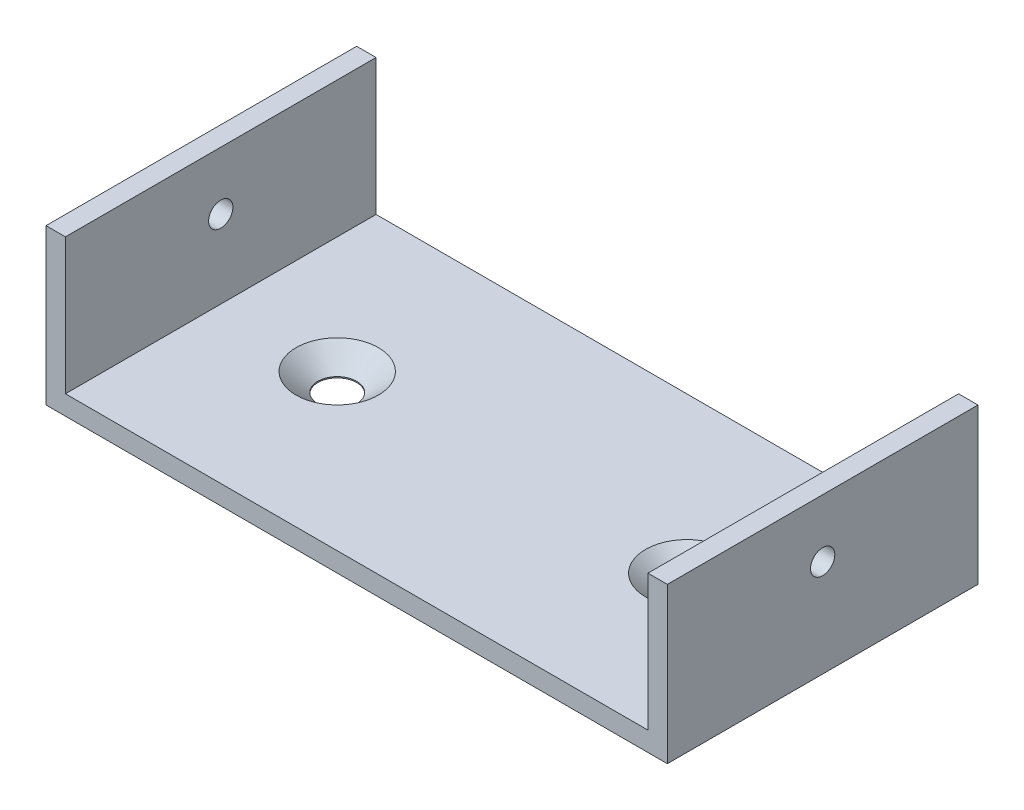
ISO-10303-21;
HEADER;
FILE_DESCRIPTION(('STEP AP214'),'2;1');
FILE_NAME('part.step','',(''),(''),'','','');
FILE_SCHEMA(('AUTOMOTIVE_DESIGN { 1 0 10303 214 1 1 1 1 }'));
ENDSEC;
DATA;
#1=APPLICATION_CONTEXT('core data for automotive mechanical design processes');
#2=APPLICATION_PROTOCOL_DEFINITION('international standard','automotive_design',2000,#1);
#3=PRODUCT_CONTEXT('',#1,'mechanical');
#4=PRODUCT('Part','Part','',(#3));
#5=PRODUCT_RELATED_PRODUCT_CATEGORY('part','',(#4));
#6=PRODUCT_DEFINITION_FORMATION('','',#4);
#7=PRODUCT_DEFINITION_CONTEXT('part definition',#1,'design');
#8=PRODUCT_DEFINITION('design','',#6,#7);
#9=PRODUCT_DEFINITION_SHAPE('','',#8);
#10=(LENGTH_UNIT() NAMED_UNIT(*) SI_UNIT(.MILLI.,.METRE.));
#11=(NAMED_UNIT(*) PLANE_ANGLE_UNIT() SI_UNIT($,.RADIAN.));
#12=(NAMED_UNIT(*) SI_UNIT($,.STERADIAN.) SOLID_ANGLE_UNIT());
#13=UNCERTAINTY_MEASURE_WITH_UNIT(LENGTH_MEASURE(1.E-05),#10,'distance_accuracy_value','');
#14=(GEOMETRIC_REPRESENTATION_CONTEXT(3) GLOBAL_UNCERTAINTY_ASSIGNED_CONTEXT((#13)) GLOBAL_UNIT_ASSIGNED_CONTEXT((#10,
#11,#12)) REPRESENTATION_CONTEXT('',''));
#15=CARTESIAN_POINT('',(0.,0.,0.));
#16=DIRECTION('',(0.,0.,1.));
#17=DIRECTION('',(1.,0.,0.));
#18=AXIS2_PLACEMENT_3D('',#15,#16,#17);
#19=CARTESIAN_POINT('',(-47.625,12.7,25.4));
#20=DIRECTION('',(0.,-1.,0.));
#21=DIRECTION('',(1.,0.,0.));
#22=AXIS2_PLACEMENT_3D('',#19,#20,#21);
#23=PLANE('',#22);
#24=DIRECTION('',(-1.,0.,0.));
#25=VECTOR('',#24,1.);
#26=CARTESIAN_POINT('',(-47.625,12.7,-25.4));
#27=LINE('',#26,#25);
#28=CARTESIAN_POINT('',(-47.625,12.7,-25.4));
#29=VERTEX_POINT('',#28);
#30=CARTESIAN_POINT('',(-50.8,12.7,-25.4));
#31=VERTEX_POINT('',#30);
#32=EDGE_CURVE('E133',#29,#31,#27,.T.);
#33=ORIENTED_EDGE('',*,*,#32,.T.);
#34=DIRECTION('',(0.,0.,-1.));
#35=VECTOR('',#34,1.);
#36=CARTESIAN_POINT('',(-50.8,12.7,25.4));
#37=LINE('',#36,#35);
#38=CARTESIAN_POINT('',(-50.8,12.7,25.4));
#39=VERTEX_POINT('',#38);
#40=EDGE_CURVE('E11',#39,#31,#37,.T.);
#41=ORIENTED_EDGE('',*,*,#40,.F.);
#42=DIRECTION('',(-1.,0.,0.));
#43=VECTOR('',#42,1.);
#44=CARTESIAN_POINT('',(-47.625,12.7,25.4));
#45=LINE('',#44,#43);
#46=CARTESIAN_POINT('',(-47.625,12.7,25.4));
#47=VERTEX_POINT('',#46);
#48=EDGE_CURVE('E148',#47,#39,#45,.T.);
#49=ORIENTED_EDGE('',*,*,#48,.F.);
#50=DIRECTION('',(0.,0.,-1.));
#51=VECTOR('',#50,1.);
#52=CARTESIAN_POINT('',(-47.625,12.7,25.4));
#53=LINE('',#52,#51);
#54=EDGE_CURVE('E129',#47,#29,#53,.T.);
#55=ORIENTED_EDGE('',*,*,#54,.T.);
#56=EDGE_LOOP('',(#33,#41,#49,#55));
#57=FACE_BOUND('',#56,.T.);
#58=ADVANCED_FACE('F36',(#57),#23,.F.);
#59=CARTESIAN_POINT('',(-50.8,12.7,25.4));
#60=DIRECTION('',(1.,0.,0.));
#61=DIRECTION('',(0.,0.,-1.));
#62=AXIS2_PLACEMENT_3D('',#59,#60,#61);
#63=PLANE('',#62);
#64=CARTESIAN_POINT('',(-50.8,3.21584337728158,0.));
#65=DIRECTION('',(1.,0.,0.));
#66=DIRECTION('',(0.,0.,-1.));
#67=AXIS2_PLACEMENT_3D('',#64,#65,#66);
#68=CIRCLE('',#67,1.98437499999997);
#69=CARTESIAN_POINT('',(-50.8,3.21584337728158,-1.98437499999997));
#70=VERTEX_POINT('',#69);
#71=EDGE_CURVE('E202',#70,#70,#68,.T.);
#72=ORIENTED_EDGE('',*,*,#71,.T.);
#73=EDGE_LOOP('',(#72));
#74=FACE_BOUND('',#73,.T.);
#75=DIRECTION('',(0.,-1.,0.));
#76=VECTOR('',#75,1.);
#77=CARTESIAN_POINT('',(-50.8,12.7,-25.4));
#78=LINE('',#77,#76);
#79=CARTESIAN_POINT('',(-50.8,-12.7,-25.4));
#80=VERTEX_POINT('',#79);
#81=EDGE_CURVE('E136',#31,#80,#78,.T.);
#82=ORIENTED_EDGE('',*,*,#81,.T.);
#83=DIRECTION('',(0.,0.,-1.));
#84=VECTOR('',#83,1.);
#85=CARTESIAN_POINT('',(-50.8,-12.7,25.4));
#86=LINE('',#85,#84);
#87=CARTESIAN_POINT('',(-50.8,-12.7,25.4));
#88=VERTEX_POINT('',#87);
#89=EDGE_CURVE('E45',#88,#80,#86,.T.);
#90=ORIENTED_EDGE('',*,*,#89,.F.);
#91=DIRECTION('',(0.,-1.,0.));
#92=VECTOR('',#91,1.);
#93=CARTESIAN_POINT('',(-50.8,12.7,25.4));
#94=LINE('',#93,#92);
#95=EDGE_CURVE('E96',#39,#88,#94,.T.);
#96=ORIENTED_EDGE('',*,*,#95,.F.);
#97=ORIENTED_EDGE('',*,*,#40,.T.);
#98=EDGE_LOOP('',(#82,#90,#96,#97));
#99=FACE_BOUND('',#98,.T.);
#100=ADVANCED_FACE('F219',(#74,#99),#63,.F.);
#101=CARTESIAN_POINT('',(-50.8,-12.7,25.4));
#102=DIRECTION('',(0.,1.,0.));
#103=DIRECTION('',(0.,0.,1.));
#104=AXIS2_PLACEMENT_3D('',#101,#102,#103);
#105=PLANE('',#104);
#106=CARTESIAN_POINT('',(-28.575,-12.7,0.));
#107=DIRECTION('',(0.,1.,0.));
#108=DIRECTION('',(0.,0.,1.));
#109=AXIS2_PLACEMENT_3D('',#106,#107,#108);
#110=CIRCLE('',#109,3.17499999999999);
#111=CARTESIAN_POINT('',(-28.575,-12.7,3.17499999999999));
#112=VERTEX_POINT('',#111);
#113=EDGE_CURVE('E190',#112,#112,#110,.T.);
#114=ORIENTED_EDGE('',*,*,#113,.T.);
#115=EDGE_LOOP('',(#114));
#116=FACE_BOUND('',#115,.T.);
#117=CARTESIAN_POINT('',(28.575,-12.7,0.));
#118=DIRECTION('',(0.,1.,0.));
#119=DIRECTION('',(0.,0.,1.));
#120=AXIS2_PLACEMENT_3D('',#117,#118,#119);
#121=CIRCLE('',#120,3.17499999999999);
#122=CARTESIAN_POINT('',(28.575,-12.7,3.175));
#123=VERTEX_POINT('',#122);
#124=EDGE_CURVE('E137',#123,#123,#121,.T.);
#125=ORIENTED_EDGE('',*,*,#124,.T.);
#126=EDGE_LOOP('',(#125));
#127=FACE_BOUND('',#126,.T.);
#128=DIRECTION('',(1.,0.,0.));
#129=VECTOR('',#128,1.);
#130=CARTESIAN_POINT('',(-50.8,-12.7,-25.4));
#131=LINE('',#130,#129);
#132=CARTESIAN_POINT('',(50.8,-12.7,-25.4));
#133=VERTEX_POINT('',#132);
#134=EDGE_CURVE('E139',#80,#133,#131,.T.);
#135=ORIENTED_EDGE('',*,*,#134,.T.);
#136=DIRECTION('',(0.,0.,-1.));
#137=VECTOR('',#136,1.);
#138=CARTESIAN_POINT('',(50.8,-12.7,25.4));
#139=LINE('',#138,#137);
#140=CARTESIAN_POINT('',(50.8,-12.7,25.4));
#141=VERTEX_POINT('',#140);
#142=EDGE_CURVE('E155',#141,#133,#139,.T.);
#143=ORIENTED_EDGE('',*,*,#142,.F.);
#144=DIRECTION('',(1.,0.,0.));
#145=VECTOR('',#144,1.);
#146=CARTESIAN_POINT('',(-50.8,-12.7,25.4));
#147=LINE('',#146,#145);
#148=EDGE_CURVE('E164',#88,#141,#147,.T.);
#149=ORIENTED_EDGE('',*,*,#148,.F.);
#150=ORIENTED_EDGE('',*,*,#89,.T.);
#151=EDGE_LOOP('',(#135,#143,#149,#150));
#152=FACE_BOUND('',#151,.T.);
#153=ADVANCED_FACE('F162',(#116,#127,#152),#105,.F.);
#154=CARTESIAN_POINT('',(50.8,-12.7,25.4));
#155=DIRECTION('',(-1.,0.,0.));
#156=DIRECTION('',(0.,0.,1.));
#157=AXIS2_PLACEMENT_3D('',#154,#155,#156);
#158=PLANE('',#157);
#159=CARTESIAN_POINT('',(50.8,3.21584337728158,0.));
#160=DIRECTION('',(1.,0.,0.));
#161=DIRECTION('',(0.,0.,-1.));
#162=AXIS2_PLACEMENT_3D('',#159,#160,#161);
#163=CIRCLE('',#162,1.98437499999999);
#164=CARTESIAN_POINT('',(50.8,3.21584337728158,-1.98437499999999));
#165=VERTEX_POINT('',#164);
#166=EDGE_CURVE('E205',#165,#165,#163,.T.);
#167=ORIENTED_EDGE('',*,*,#166,.F.);
#168=EDGE_LOOP('',(#167));
#169=FACE_BOUND('',#168,.T.);
#170=DIRECTION('',(0.,1.,0.));
#171=VECTOR('',#170,1.);
#172=CARTESIAN_POINT('',(50.8,-12.7,-25.4));
#173=LINE('',#172,#171);
#174=CARTESIAN_POINT('',(50.8,12.7,-25.4));
#175=VERTEX_POINT('',#174);
#176=EDGE_CURVE('E141',#133,#175,#173,.T.);
#177=ORIENTED_EDGE('',*,*,#176,.T.);
#178=DIRECTION('',(0.,0.,-1.));
#179=VECTOR('',#178,1.);
#180=CARTESIAN_POINT('',(50.8,12.7,25.4));
#181=LINE('',#180,#179);
#182=CARTESIAN_POINT('',(50.8,12.7,25.4));
#183=VERTEX_POINT('',#182);
#184=EDGE_CURVE('E152',#183,#175,#181,.T.);
#185=ORIENTED_EDGE('',*,*,#184,.F.);
#186=DIRECTION('',(0.,1.,0.));
#187=VECTOR('',#186,1.);
#188=CARTESIAN_POINT('',(50.8,-12.7,25.4));
#189=LINE('',#188,#187);
#190=EDGE_CURVE('E176',#141,#183,#189,.T.);
#191=ORIENTED_EDGE('',*,*,#190,.F.);
#192=ORIENTED_EDGE('',*,*,#142,.T.);
#193=EDGE_LOOP('',(#177,#185,#191,#192));
#194=FACE_BOUND('',#193,.T.);
#195=ADVANCED_FACE('F172',(#169,#194),#158,.F.);
#196=CARTESIAN_POINT('',(50.8,12.7,25.4));
#197=DIRECTION('',(0.,-1.,0.));
#198=DIRECTION('',(1.,0.,0.));
#199=AXIS2_PLACEMENT_3D('',#196,#197,#198);
#200=PLANE('',#199);
#201=DIRECTION('',(-1.,0.,0.));
#202=VECTOR('',#201,1.);
#203=CARTESIAN_POINT('',(50.8,12.7,-25.4));
#204=LINE('',#203,#202);
#205=CARTESIAN_POINT('',(47.625,12.7,-25.4));
#206=VERTEX_POINT('',#205);
#207=EDGE_CURVE('E143',#175,#206,#204,.T.);
#208=ORIENTED_EDGE('',*,*,#207,.T.);
#209=DIRECTION('',(0.,0.,-1.));
#210=VECTOR('',#209,1.);
#211=CARTESIAN_POINT('',(47.625,12.7,25.4));
#212=LINE('',#211,#210);
#213=CARTESIAN_POINT('',(47.625,12.7,25.4));
#214=VERTEX_POINT('',#213);
#215=EDGE_CURVE('E124',#214,#206,#212,.T.);
#216=ORIENTED_EDGE('',*,*,#215,.F.);
#217=DIRECTION('',(-1.,0.,0.));
#218=VECTOR('',#217,1.);
#219=CARTESIAN_POINT('',(50.8,12.7,25.4));
#220=LINE('',#219,#218);
#221=EDGE_CURVE('E115',#183,#214,#220,.T.);
#222=ORIENTED_EDGE('',*,*,#221,.F.);
#223=ORIENTED_EDGE('',*,*,#184,.T.);
#224=EDGE_LOOP('',(#208,#216,#222,#223));
#225=FACE_BOUND('',#224,.T.);
#226=ADVANCED_FACE('F175',(#225),#200,.F.);
#227=CARTESIAN_POINT('',(47.625,12.7,25.4));
#228=DIRECTION('',(1.,0.,0.));
#229=DIRECTION('',(0.,0.,-1.));
#230=AXIS2_PLACEMENT_3D('',#227,#228,#229);
#231=PLANE('',#230);
#232=CARTESIAN_POINT('',(47.625,3.21584337728158,0.));
#233=DIRECTION('',(1.,0.,0.));
#234=DIRECTION('',(0.,0.,-1.));
#235=AXIS2_PLACEMENT_3D('',#232,#233,#234);
#236=CIRCLE('',#235,1.98437499999998);
#237=CARTESIAN_POINT('',(47.625,3.21584337728158,-1.98437499999998));
#238=VERTEX_POINT('',#237);
#239=EDGE_CURVE('E39',#238,#238,#236,.T.);
#240=ORIENTED_EDGE('',*,*,#239,.T.);
#241=EDGE_LOOP('',(#240));
#242=FACE_BOUND('',#241,.T.);
#243=DIRECTION('',(0.,-1.,0.));
#244=VECTOR('',#243,1.);
#245=CARTESIAN_POINT('',(47.625,12.7,-25.4));
#246=LINE('',#245,#244);
#247=CARTESIAN_POINT('',(47.625,-9.525,-25.4));
#248=VERTEX_POINT('',#247);
#249=EDGE_CURVE('E123',#206,#248,#246,.T.);
#250=ORIENTED_EDGE('',*,*,#249,.T.);
#251=DIRECTION('',(0.,0.,-1.));
#252=VECTOR('',#251,1.);
#253=CARTESIAN_POINT('',(47.625,-9.525,25.4));
#254=LINE('',#253,#252);
#255=CARTESIAN_POINT('',(47.625,-9.525,25.4));
#256=VERTEX_POINT('',#255);
#257=EDGE_CURVE('E120',#256,#248,#254,.T.);
#258=ORIENTED_EDGE('',*,*,#257,.F.);
#259=DIRECTION('',(0.,-1.,0.));
#260=VECTOR('',#259,1.);
#261=CARTESIAN_POINT('',(47.625,12.7,25.4));
#262=LINE('',#261,#260);
#263=EDGE_CURVE('E109',#214,#256,#262,.T.);
#264=ORIENTED_EDGE('',*,*,#263,.F.);
#265=ORIENTED_EDGE('',*,*,#215,.T.);
#266=EDGE_LOOP('',(#250,#258,#264,#265));
#267=FACE_BOUND('',#266,.T.);
#268=ADVANCED_FACE('F121',(#242,#267),#231,.F.);
#269=CARTESIAN_POINT('',(47.625,-9.525,25.4));
#270=DIRECTION('',(0.,-1.,0.));
#271=DIRECTION('',(1.,0.,0.));
#272=AXIS2_PLACEMENT_3D('',#269,#270,#271);
#273=PLANE('',#272);
#274=CARTESIAN_POINT('',(-28.575,-9.52500000000001,0.));
#275=DIRECTION('',(0.,1.,0.));
#276=DIRECTION('',(0.,0.,1.));
#277=AXIS2_PLACEMENT_3D('',#274,#275,#276);
#278=CIRCLE('',#277,6.731);
#279=CARTESIAN_POINT('',(-28.575,-9.52500000000001,6.731));
#280=VERTEX_POINT('',#279);
#281=EDGE_CURVE('E196',#280,#280,#278,.T.);
#282=ORIENTED_EDGE('',*,*,#281,.F.);
#283=EDGE_LOOP('',(#282));
#284=FACE_BOUND('',#283,.T.);
#285=CARTESIAN_POINT('',(28.575,-9.525,0.));
#286=DIRECTION('',(0.,1.,0.));
#287=DIRECTION('',(0.,0.,1.));
#288=AXIS2_PLACEMENT_3D('',#285,#286,#287);
#289=CIRCLE('',#288,6.731);
#290=CARTESIAN_POINT('',(28.575,-9.525,6.731));
#291=VERTEX_POINT('',#290);
#292=EDGE_CURVE('E187',#291,#291,#289,.T.);
#293=ORIENTED_EDGE('',*,*,#292,.F.);
#294=EDGE_LOOP('',(#293));
#295=FACE_BOUND('',#294,.T.);
#296=DIRECTION('',(-1.,0.,0.));
#297=VECTOR('',#296,1.);
#298=CARTESIAN_POINT('',(47.625,-9.525,-25.4));
#299=LINE('',#298,#297);
#300=CARTESIAN_POINT('',(-47.625,-9.52500000000001,-25.4));
#301=VERTEX_POINT('',#300);
#302=EDGE_CURVE('E82',#248,#301,#299,.T.);
#303=ORIENTED_EDGE('',*,*,#302,.T.);
#304=DIRECTION('',(0.,0.,-1.));
#305=VECTOR('',#304,1.);
#306=CARTESIAN_POINT('',(-47.625,-9.52500000000001,25.4));
#307=LINE('',#306,#305);
#308=CARTESIAN_POINT('',(-47.625,-9.52500000000001,25.4));
#309=VERTEX_POINT('',#308);
#310=EDGE_CURVE('E125',#309,#301,#307,.T.);
#311=ORIENTED_EDGE('',*,*,#310,.F.);
#312=DIRECTION('',(-1.,0.,0.));
#313=VECTOR('',#312,1.);
#314=CARTESIAN_POINT('',(47.625,-9.525,25.4));
#315=LINE('',#314,#313);
#316=EDGE_CURVE('E113',#256,#309,#315,.T.);
#317=ORIENTED_EDGE('',*,*,#316,.F.);
#318=ORIENTED_EDGE('',*,*,#257,.T.);
#319=EDGE_LOOP('',(#303,#311,#317,#318));
#320=FACE_BOUND('',#319,.T.);
#321=ADVANCED_FACE('F127',(#284,#295,#320),#273,.F.);
#322=CARTESIAN_POINT('',(-47.625,-9.52500000000001,25.4));
#323=DIRECTION('',(-1.,0.,0.));
#324=DIRECTION('',(0.,0.,1.));
#325=AXIS2_PLACEMENT_3D('',#322,#323,#324);
#326=PLANE('',#325);
#327=CARTESIAN_POINT('',(-47.625,3.21584337728158,0.));
#328=DIRECTION('',(-1.,0.,0.));
#329=DIRECTION('',(0.,0.,1.));
#330=AXIS2_PLACEMENT_3D('',#327,#328,#329);
#331=CIRCLE('',#330,1.98437499999998);
#332=CARTESIAN_POINT('',(-47.625,3.21584337728158,1.98437499999998));
#333=VERTEX_POINT('',#332);
#334=EDGE_CURVE('E199',#333,#333,#331,.T.);
#335=ORIENTED_EDGE('',*,*,#334,.T.);
#336=EDGE_LOOP('',(#335));
#337=FACE_BOUND('',#336,.T.);
#338=DIRECTION('',(0.,1.,0.));
#339=VECTOR('',#338,1.);
#340=CARTESIAN_POINT('',(-47.625,-9.52500000000001,-25.4));
#341=LINE('',#340,#339);
#342=EDGE_CURVE('E88',#301,#29,#341,.T.);
#343=ORIENTED_EDGE('',*,*,#342,.T.);
#344=ORIENTED_EDGE('',*,*,#54,.F.);
#345=DIRECTION('',(0.,1.,0.));
#346=VECTOR('',#345,1.);
#347=CARTESIAN_POINT('',(-47.625,-9.52500000000001,25.4));
#348=LINE('',#347,#346);
#349=EDGE_CURVE('E53',#309,#47,#348,.T.);
#350=ORIENTED_EDGE('',*,*,#349,.F.);
#351=ORIENTED_EDGE('',*,*,#310,.T.);
#352=EDGE_LOOP('',(#343,#344,#350,#351));
#353=FACE_BOUND('',#352,.T.);
#354=ADVANCED_FACE('F230',(#337,#353),#326,.F.);
#355=CARTESIAN_POINT('',(0.,0.,25.4));
#356=DIRECTION('',(0.,0.,1.));
#357=DIRECTION('',(1.,0.,0.));
#358=AXIS2_PLACEMENT_3D('',#355,#356,#357);
#359=PLANE('',#358);
#360=ORIENTED_EDGE('',*,*,#48,.T.);
#361=ORIENTED_EDGE('',*,*,#95,.T.);
#362=ORIENTED_EDGE('',*,*,#148,.T.);
#363=ORIENTED_EDGE('',*,*,#190,.T.);
#364=ORIENTED_EDGE('',*,*,#221,.T.);
#365=ORIENTED_EDGE('',*,*,#263,.T.);
#366=ORIENTED_EDGE('',*,*,#316,.T.);
#367=ORIENTED_EDGE('',*,*,#349,.T.);
#368=EDGE_LOOP('',(#360,#361,#362,#363,#364,#365,#366,#367));
#369=FACE_BOUND('',#368,.T.);
#370=ADVANCED_FACE('F111',(#369),#359,.T.);
#371=CARTESIAN_POINT('',(0.,0.,-25.4));
#372=DIRECTION('',(0.,0.,1.));
#373=DIRECTION('',(1.,0.,0.));
#374=AXIS2_PLACEMENT_3D('',#371,#372,#373);
#375=PLANE('',#374);
#376=ORIENTED_EDGE('',*,*,#32,.F.);
#377=ORIENTED_EDGE('',*,*,#342,.F.);
#378=ORIENTED_EDGE('',*,*,#302,.F.);
#379=ORIENTED_EDGE('',*,*,#249,.F.);
#380=ORIENTED_EDGE('',*,*,#207,.F.);
#381=ORIENTED_EDGE('',*,*,#176,.F.);
#382=ORIENTED_EDGE('',*,*,#134,.F.);
#383=ORIENTED_EDGE('',*,*,#81,.F.);
#384=EDGE_LOOP('',(#376,#377,#378,#379,#380,#381,#382,#383));
#385=FACE_BOUND('',#384,.T.);
#386=ADVANCED_FACE('F168',(#385),#375,.F.);
#387=CARTESIAN_POINT('',(28.575,-9.525,0.));
#388=DIRECTION('',(0.,1.,0.));
#389=DIRECTION('',(0.,0.,1.));
#390=AXIS2_PLACEMENT_3D('',#387,#388,#389);
#391=CYLINDRICAL_SURFACE('',#390,3.175);
#392=ORIENTED_EDGE('',*,*,#124,.F.);
#393=EDGE_LOOP('',(#392));
#394=FACE_BOUND('',#393,.T.);
#395=CARTESIAN_POINT('',(28.575,-12.5088382884664,0.));
#396=DIRECTION('',(0.,1.,0.));
#397=DIRECTION('',(0.,0.,1.));
#398=AXIS2_PLACEMENT_3D('',#395,#396,#397);
#399=CIRCLE('',#398,3.175);
#400=CARTESIAN_POINT('',(28.575,-12.5088382884664,3.175));
#401=VERTEX_POINT('',#400);
#402=EDGE_CURVE('E184',#401,#401,#399,.T.);
#403=ORIENTED_EDGE('',*,*,#402,.T.);
#404=EDGE_LOOP('',(#403));
#405=FACE_BOUND('',#404,.T.);
#406=ADVANCED_FACE('F268',(#394,#405),#391,.F.);
#407=CARTESIAN_POINT('',(28.575,-9.525,0.));
#408=DIRECTION('',(0.,1.,0.));
#409=DIRECTION('',(0.,0.,1.));
#410=AXIS2_PLACEMENT_3D('',#407,#408,#409);
#411=CONICAL_SURFACE('',#410,6.731,0.872664625997164);
#412=ORIENTED_EDGE('',*,*,#402,.F.);
#413=EDGE_LOOP('',(#412));
#414=FACE_BOUND('',#413,.T.);
#415=ORIENTED_EDGE('',*,*,#292,.T.);
#416=EDGE_LOOP('',(#415));
#417=FACE_BOUND('',#416,.T.);
#418=ADVANCED_FACE('F264',(#414,#417),#411,.F.);
#419=CARTESIAN_POINT('',(-28.575,-9.52500000000001,0.));
#420=DIRECTION('',(0.,1.,0.));
#421=DIRECTION('',(0.,0.,1.));
#422=AXIS2_PLACEMENT_3D('',#419,#420,#421);
#423=CYLINDRICAL_SURFACE('',#422,3.175);
#424=ORIENTED_EDGE('',*,*,#113,.F.);
#425=EDGE_LOOP('',(#424));
#426=FACE_BOUND('',#425,.T.);
#427=CARTESIAN_POINT('',(-28.575,-12.5088382884664,0.));
#428=DIRECTION('',(0.,1.,0.));
#429=DIRECTION('',(0.,0.,1.));
#430=AXIS2_PLACEMENT_3D('',#427,#428,#429);
#431=CIRCLE('',#430,3.175);
#432=CARTESIAN_POINT('',(-28.575,-12.5088382884664,3.175));
#433=VERTEX_POINT('',#432);
#434=EDGE_CURVE('E193',#433,#433,#431,.T.);
#435=ORIENTED_EDGE('',*,*,#434,.T.);
#436=EDGE_LOOP('',(#435));
#437=FACE_BOUND('',#436,.T.);
#438=ADVANCED_FACE('F258',(#426,#437),#423,.F.);
#439=CARTESIAN_POINT('',(-28.575,-9.52500000000001,0.));
#440=DIRECTION('',(0.,1.,0.));
#441=DIRECTION('',(0.,0.,1.));
#442=AXIS2_PLACEMENT_3D('',#439,#440,#441);
#443=CONICAL_SURFACE('',#442,6.731,0.872664625997165);
#444=ORIENTED_EDGE('',*,*,#434,.F.);
#445=EDGE_LOOP('',(#444));
#446=FACE_BOUND('',#445,.T.);
#447=ORIENTED_EDGE('',*,*,#281,.T.);
#448=EDGE_LOOP('',(#447));
#449=FACE_BOUND('',#448,.T.);
#450=ADVANCED_FACE('F251',(#446,#449),#443,.F.);
#451=CARTESIAN_POINT('',(50.8,3.21584337728158,0.));
#452=DIRECTION('',(1.,0.,0.));
#453=DIRECTION('',(0.,0.,-1.));
#454=AXIS2_PLACEMENT_3D('',#451,#452,#453);
#455=CYLINDRICAL_SURFACE('',#454,1.98437499999998);
#456=ORIENTED_EDGE('',*,*,#166,.T.);
#457=EDGE_LOOP('',(#456));
#458=FACE_BOUND('',#457,.T.);
#459=ORIENTED_EDGE('',*,*,#239,.F.);
#460=EDGE_LOOP('',(#459));
#461=FACE_BOUND('',#460,.T.);
#462=ADVANCED_FACE('F209',(#458,#461),#455,.F.);
#463=ORIENTED_EDGE('',*,*,#71,.F.);
#464=EDGE_LOOP('',(#463));
#465=FACE_BOUND('',#464,.T.);
#466=ORIENTED_EDGE('',*,*,#334,.F.);
#467=EDGE_LOOP('',(#466));
#468=FACE_BOUND('',#467,.T.);
#469=ADVANCED_FACE('F250',(#465,#468),#455,.F.);
#470=CLOSED_SHELL('',(#58,#100,#153,#195,#226,#268,#321,#354,#370,#386,#406,#418,#438,#450,#462,#469));
#471=MANIFOLD_SOLID_BREP('B2',#470);
#472=ADVANCED_BREP_SHAPE_REPRESENTATION('',(#18,#471),#14);
#473=SHAPE_DEFINITION_REPRESENTATION(#9,#472);
ENDSEC;
END-ISO-10303-21;
